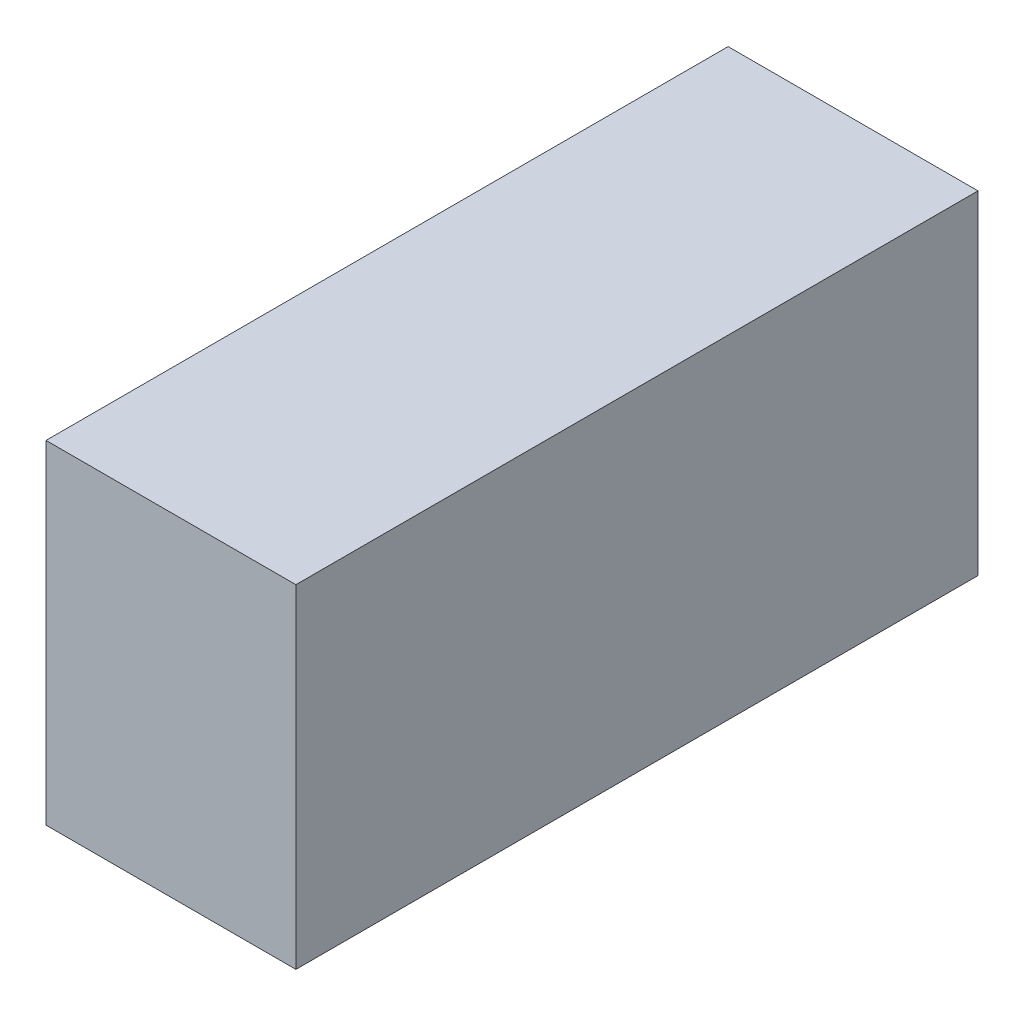
ISO-10303-21;
HEADER;
FILE_DESCRIPTION(('STEP AP214'),'2;1');
FILE_NAME('part.step','',(''),(''),'','','');
FILE_SCHEMA(('AUTOMOTIVE_DESIGN { 1 0 10303 214 1 1 1 1 }'));
ENDSEC;
DATA;
#1=APPLICATION_CONTEXT('core data for automotive mechanical design processes');
#2=APPLICATION_PROTOCOL_DEFINITION('international standard','automotive_design',2000,#1);
#3=PRODUCT_CONTEXT('',#1,'mechanical');
#4=PRODUCT('Part','Part','',(#3));
#5=PRODUCT_RELATED_PRODUCT_CATEGORY('part','',(#4));
#6=PRODUCT_DEFINITION_FORMATION('','',#4);
#7=PRODUCT_DEFINITION_CONTEXT('part definition',#1,'design');
#8=PRODUCT_DEFINITION('design','',#6,#7);
#9=PRODUCT_DEFINITION_SHAPE('','',#8);
#10=(LENGTH_UNIT() NAMED_UNIT(*) SI_UNIT(.MILLI.,.METRE.));
#11=(NAMED_UNIT(*) PLANE_ANGLE_UNIT() SI_UNIT($,.RADIAN.));
#12=(NAMED_UNIT(*) SI_UNIT($,.STERADIAN.) SOLID_ANGLE_UNIT());
#13=UNCERTAINTY_MEASURE_WITH_UNIT(LENGTH_MEASURE(1.E-05),#10,'distance_accuracy_value','');
#14=(GEOMETRIC_REPRESENTATION_CONTEXT(3) GLOBAL_UNCERTAINTY_ASSIGNED_CONTEXT((#13)) GLOBAL_UNIT_ASSIGNED_CONTEXT((#10,
#11,#12)) REPRESENTATION_CONTEXT('',''));
#15=CARTESIAN_POINT('',(0.,0.,0.));
#16=DIRECTION('',(0.,0.,1.));
#17=DIRECTION('',(1.,0.,0.));
#18=AXIS2_PLACEMENT_3D('',#15,#16,#17);
#19=CARTESIAN_POINT('',(-0.437500000000002,2.675,13.));
#20=DIRECTION('',(-1.,0.,0.));
#21=DIRECTION('',(0.,-1.,0.));
#22=AXIS2_PLACEMENT_3D('',#19,#20,#21);
#23=PLANE('',#22);
#24=DIRECTION('',(0.,1.,0.));
#25=VECTOR('',#24,1.);
#26=CARTESIAN_POINT('',(-0.437500000000002,2.675,0.));
#27=LINE('',#26,#25);
#28=CARTESIAN_POINT('',(-0.437500000000001,-3.675,0.));
#29=VERTEX_POINT('',#28);
#30=CARTESIAN_POINT('',(-0.437500000000002,2.675,0.));
#31=VERTEX_POINT('',#30);
#32=EDGE_CURVE('E96',#29,#31,#27,.T.);
#33=ORIENTED_EDGE('',*,*,#32,.T.);
#34=DIRECTION('',(0.,0.,-1.));
#35=VECTOR('',#34,1.);
#36=CARTESIAN_POINT('',(-0.437500000000002,2.675,13.));
#37=LINE('',#36,#35);
#38=CARTESIAN_POINT('',(-0.437500000000002,2.675,13.));
#39=VERTEX_POINT('',#38);
#40=EDGE_CURVE('E11',#39,#31,#37,.T.);
#41=ORIENTED_EDGE('',*,*,#40,.F.);
#42=DIRECTION('',(0.,1.,0.));
#43=VECTOR('',#42,1.);
#44=CARTESIAN_POINT('',(-0.437500000000002,2.675,13.));
#45=LINE('',#44,#43);
#46=CARTESIAN_POINT('',(-0.437500000000001,-3.675,13.));
#47=VERTEX_POINT('',#46);
#48=EDGE_CURVE('E84',#47,#39,#45,.T.);
#49=ORIENTED_EDGE('',*,*,#48,.F.);
#50=DIRECTION('',(0.,0.,-1.));
#51=VECTOR('',#50,1.);
#52=CARTESIAN_POINT('',(-0.437500000000001,-3.675,13.));
#53=LINE('',#52,#51);
#54=EDGE_CURVE('E92',#47,#29,#53,.T.);
#55=ORIENTED_EDGE('',*,*,#54,.T.);
#56=EDGE_LOOP('',(#33,#41,#49,#55));
#57=FACE_BOUND('',#56,.T.);
#58=ADVANCED_FACE('F33',(#57),#23,.F.);
#59=CARTESIAN_POINT('',(-0.437500000000002,2.675,13.));
#60=DIRECTION('',(0.,-1.,0.));
#61=DIRECTION('',(0.,0.,-1.));
#62=AXIS2_PLACEMENT_3D('',#59,#60,#61);
#63=PLANE('',#62);
#64=DIRECTION('',(-1.,0.,0.));
#65=VECTOR('',#64,1.);
#66=CARTESIAN_POINT('',(-0.437500000000002,2.675,0.));
#67=LINE('',#66,#65);
#68=CARTESIAN_POINT('',(-5.2,2.675,0.));
#69=VERTEX_POINT('',#68);
#70=EDGE_CURVE('E88',#31,#69,#67,.T.);
#71=ORIENTED_EDGE('',*,*,#70,.T.);
#72=DIRECTION('',(0.,0.,-1.));
#73=VECTOR('',#72,1.);
#74=CARTESIAN_POINT('',(-5.2,2.675,13.));
#75=LINE('',#74,#73);
#76=CARTESIAN_POINT('',(-5.2,2.675,13.));
#77=VERTEX_POINT('',#76);
#78=EDGE_CURVE('E41',#77,#69,#75,.T.);
#79=ORIENTED_EDGE('',*,*,#78,.F.);
#80=DIRECTION('',(-1.,0.,0.));
#81=VECTOR('',#80,1.);
#82=CARTESIAN_POINT('',(-0.437500000000002,2.675,13.));
#83=LINE('',#82,#81);
#84=EDGE_CURVE('E79',#39,#77,#83,.T.);
#85=ORIENTED_EDGE('',*,*,#84,.F.);
#86=ORIENTED_EDGE('',*,*,#40,.T.);
#87=EDGE_LOOP('',(#71,#79,#85,#86));
#88=FACE_BOUND('',#87,.T.);
#89=ADVANCED_FACE('F87',(#88),#63,.F.);
#90=CARTESIAN_POINT('',(-5.2,2.675,13.));
#91=DIRECTION('',(1.,0.,0.));
#92=DIRECTION('',(0.,0.,-1.));
#93=AXIS2_PLACEMENT_3D('',#90,#91,#92);
#94=PLANE('',#93);
#95=DIRECTION('',(0.,-1.,0.));
#96=VECTOR('',#95,1.);
#97=CARTESIAN_POINT('',(-5.2,2.675,0.));
#98=LINE('',#97,#96);
#99=CARTESIAN_POINT('',(-5.2,-3.675,0.));
#100=VERTEX_POINT('',#99);
#101=EDGE_CURVE('E66',#69,#100,#98,.T.);
#102=ORIENTED_EDGE('',*,*,#101,.T.);
#103=DIRECTION('',(0.,0.,-1.));
#104=VECTOR('',#103,1.);
#105=CARTESIAN_POINT('',(-5.2,-3.675,13.));
#106=LINE('',#105,#104);
#107=CARTESIAN_POINT('',(-5.2,-3.675,13.));
#108=VERTEX_POINT('',#107);
#109=EDGE_CURVE('E89',#108,#100,#106,.T.);
#110=ORIENTED_EDGE('',*,*,#109,.F.);
#111=DIRECTION('',(0.,-1.,0.));
#112=VECTOR('',#111,1.);
#113=CARTESIAN_POINT('',(-5.2,2.675,13.));
#114=LINE('',#113,#112);
#115=EDGE_CURVE('E82',#77,#108,#114,.T.);
#116=ORIENTED_EDGE('',*,*,#115,.F.);
#117=ORIENTED_EDGE('',*,*,#78,.T.);
#118=EDGE_LOOP('',(#102,#110,#116,#117));
#119=FACE_BOUND('',#118,.T.);
#120=ADVANCED_FACE('F90',(#119),#94,.F.);
#121=CARTESIAN_POINT('',(-0.437500000000001,-3.675,13.));
#122=DIRECTION('',(0.,1.,0.));
#123=DIRECTION('',(-1.,0.,0.));
#124=AXIS2_PLACEMENT_3D('',#121,#122,#123);
#125=PLANE('',#124);
#126=DIRECTION('',(1.,0.,0.));
#127=VECTOR('',#126,1.);
#128=CARTESIAN_POINT('',(-0.437500000000001,-3.675,0.));
#129=LINE('',#128,#127);
#130=EDGE_CURVE('E72',#100,#29,#129,.T.);
#131=ORIENTED_EDGE('',*,*,#130,.T.);
#132=ORIENTED_EDGE('',*,*,#54,.F.);
#133=DIRECTION('',(1.,0.,0.));
#134=VECTOR('',#133,1.);
#135=CARTESIAN_POINT('',(-0.437500000000001,-3.675,13.));
#136=LINE('',#135,#134);
#137=EDGE_CURVE('E49',#108,#47,#136,.T.);
#138=ORIENTED_EDGE('',*,*,#137,.F.);
#139=ORIENTED_EDGE('',*,*,#109,.T.);
#140=EDGE_LOOP('',(#131,#132,#138,#139));
#141=FACE_BOUND('',#140,.T.);
#142=ADVANCED_FACE('F103',(#141),#125,.F.);
#143=CARTESIAN_POINT('',(0.,0.,13.));
#144=DIRECTION('',(0.,0.,-1.));
#145=DIRECTION('',(-1.,0.,0.));
#146=AXIS2_PLACEMENT_3D('',#143,#144,#145);
#147=PLANE('',#146);
#148=ORIENTED_EDGE('',*,*,#48,.T.);
#149=ORIENTED_EDGE('',*,*,#84,.T.);
#150=ORIENTED_EDGE('',*,*,#115,.T.);
#151=ORIENTED_EDGE('',*,*,#137,.T.);
#152=EDGE_LOOP('',(#148,#149,#150,#151));
#153=FACE_BOUND('',#152,.T.);
#154=ADVANCED_FACE('F80',(#153),#147,.F.);
#155=CARTESIAN_POINT('',(0.,0.,0.));
#156=DIRECTION('',(0.,0.,-1.));
#157=DIRECTION('',(-1.,0.,0.));
#158=AXIS2_PLACEMENT_3D('',#155,#156,#157);
#159=PLANE('',#158);
#160=ORIENTED_EDGE('',*,*,#32,.F.);
#161=ORIENTED_EDGE('',*,*,#130,.F.);
#162=ORIENTED_EDGE('',*,*,#101,.F.);
#163=ORIENTED_EDGE('',*,*,#70,.F.);
#164=EDGE_LOOP('',(#160,#161,#162,#163));
#165=FACE_BOUND('',#164,.T.);
#166=ADVANCED_FACE('F106',(#165),#159,.T.);
#167=CLOSED_SHELL('',(#58,#89,#120,#142,#154,#166));
#168=MANIFOLD_SOLID_BREP('B2',#167);
#169=ADVANCED_BREP_SHAPE_REPRESENTATION('',(#18,#168),#14);
#170=SHAPE_DEFINITION_REPRESENTATION(#9,#169);
ENDSEC;
END-ISO-10303-21;
